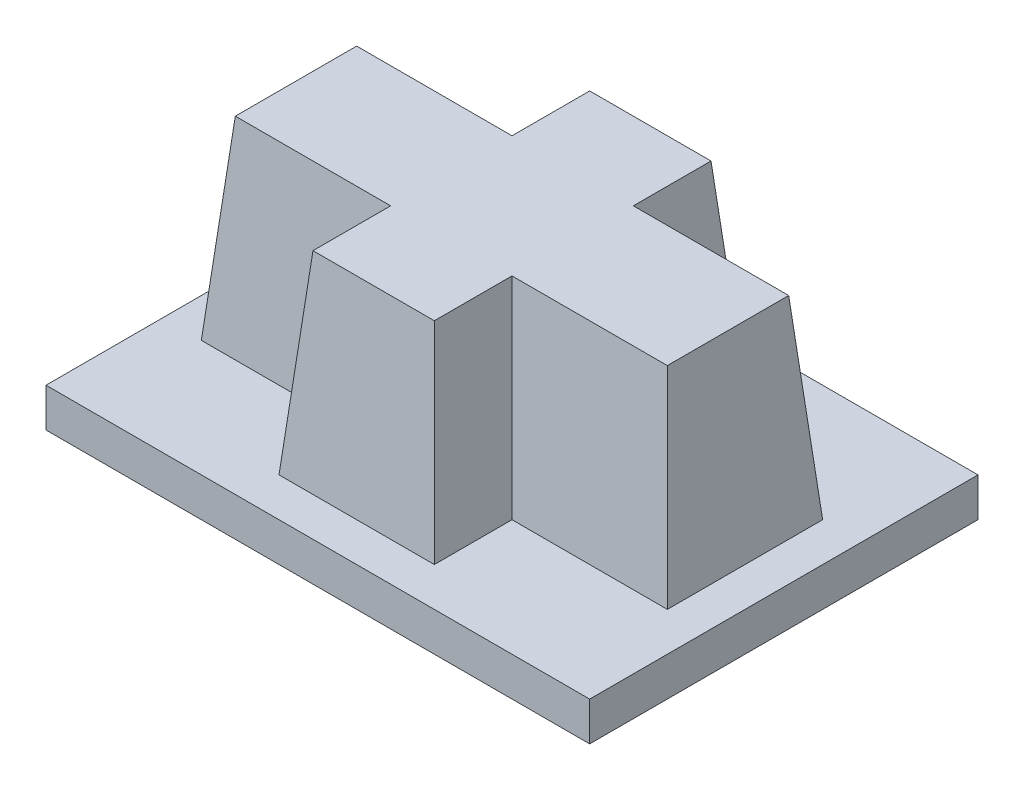
ISO-10303-21;
HEADER;
FILE_DESCRIPTION(('STEP AP214'),'2;1');
FILE_NAME('part.step','',(''),(''),'','','');
FILE_SCHEMA(('AUTOMOTIVE_DESIGN { 1 0 10303 214 1 1 1 1 }'));
ENDSEC;
DATA;
#1=APPLICATION_CONTEXT('core data for automotive mechanical design processes');
#2=APPLICATION_PROTOCOL_DEFINITION('international standard','automotive_design',2000,#1);
#3=PRODUCT_CONTEXT('',#1,'mechanical');
#4=PRODUCT('Part','Part','',(#3));
#5=PRODUCT_RELATED_PRODUCT_CATEGORY('part','',(#4));
#6=PRODUCT_DEFINITION_FORMATION('','',#4);
#7=PRODUCT_DEFINITION_CONTEXT('part definition',#1,'design');
#8=PRODUCT_DEFINITION('design','',#6,#7);
#9=PRODUCT_DEFINITION_SHAPE('','',#8);
#10=(LENGTH_UNIT() NAMED_UNIT(*) SI_UNIT(.MILLI.,.METRE.));
#11=(NAMED_UNIT(*) PLANE_ANGLE_UNIT() SI_UNIT($,.RADIAN.));
#12=(NAMED_UNIT(*) SI_UNIT($,.STERADIAN.) SOLID_ANGLE_UNIT());
#13=UNCERTAINTY_MEASURE_WITH_UNIT(LENGTH_MEASURE(1.E-05),#10,'distance_accuracy_value','');
#14=(GEOMETRIC_REPRESENTATION_CONTEXT(3) GLOBAL_UNCERTAINTY_ASSIGNED_CONTEXT((#13)) GLOBAL_UNIT_ASSIGNED_CONTEXT((#10,
#11,#12)) REPRESENTATION_CONTEXT('',''));
#15=CARTESIAN_POINT('',(0.,0.,0.));
#16=DIRECTION('',(0.,0.,1.));
#17=DIRECTION('',(1.,0.,0.));
#18=AXIS2_PLACEMENT_3D('',#15,#16,#17);
#19=CARTESIAN_POINT('',(70.,10.,-50.));
#20=DIRECTION('',(-1.,0.,0.));
#21=DIRECTION('',(0.,0.,1.));
#22=AXIS2_PLACEMENT_3D('',#19,#20,#21);
#23=PLANE('',#22);
#24=DIRECTION('',(0.,0.,-1.));
#25=VECTOR('',#24,1.);
#26=CARTESIAN_POINT('',(70.,0.,-50.));
#27=LINE('',#26,#25);
#28=CARTESIAN_POINT('',(70.,0.,50.));
#29=VERTEX_POINT('',#28);
#30=CARTESIAN_POINT('',(70.,0.,-50.));
#31=VERTEX_POINT('',#30);
#32=EDGE_CURVE('E178',#29,#31,#27,.T.);
#33=ORIENTED_EDGE('',*,*,#32,.T.);
#34=DIRECTION('',(0.,-1.,0.));
#35=VECTOR('',#34,1.);
#36=CARTESIAN_POINT('',(70.,10.,-50.));
#37=LINE('',#36,#35);
#38=CARTESIAN_POINT('',(70.,10.,-50.));
#39=VERTEX_POINT('',#38);
#40=EDGE_CURVE('E11',#39,#31,#37,.T.);
#41=ORIENTED_EDGE('',*,*,#40,.F.);
#42=DIRECTION('',(0.,0.,-1.));
#43=VECTOR('',#42,1.);
#44=CARTESIAN_POINT('',(70.,10.,-50.));
#45=LINE('',#44,#43);
#46=CARTESIAN_POINT('',(70.,10.,50.));
#47=VERTEX_POINT('',#46);
#48=EDGE_CURVE('E221',#47,#39,#45,.T.);
#49=ORIENTED_EDGE('',*,*,#48,.F.);
#50=DIRECTION('',(0.,-1.,0.));
#51=VECTOR('',#50,1.);
#52=CARTESIAN_POINT('',(70.,10.,50.));
#53=LINE('',#52,#51);
#54=EDGE_CURVE('E235',#47,#29,#53,.T.);
#55=ORIENTED_EDGE('',*,*,#54,.T.);
#56=EDGE_LOOP('',(#33,#41,#49,#55));
#57=FACE_BOUND('',#56,.T.);
#58=ADVANCED_FACE('F39',(#57),#23,.F.);
#59=CARTESIAN_POINT('',(-70.,10.,-50.));
#60=DIRECTION('',(0.,0.,1.));
#61=DIRECTION('',(1.,0.,0.));
#62=AXIS2_PLACEMENT_3D('',#59,#60,#61);
#63=PLANE('',#62);
#64=DIRECTION('',(-1.,0.,0.));
#65=VECTOR('',#64,1.);
#66=CARTESIAN_POINT('',(-70.,0.,-50.));
#67=LINE('',#66,#65);
#68=CARTESIAN_POINT('',(-70.,0.,-50.));
#69=VERTEX_POINT('',#68);
#70=EDGE_CURVE('E239',#31,#69,#67,.T.);
#71=ORIENTED_EDGE('',*,*,#70,.T.);
#72=DIRECTION('',(0.,-1.,0.));
#73=VECTOR('',#72,1.);
#74=CARTESIAN_POINT('',(-70.,10.,-50.));
#75=LINE('',#74,#73);
#76=CARTESIAN_POINT('',(-70.,10.,-50.));
#77=VERTEX_POINT('',#76);
#78=EDGE_CURVE('E47',#77,#69,#75,.T.);
#79=ORIENTED_EDGE('',*,*,#78,.F.);
#80=DIRECTION('',(-1.,0.,0.));
#81=VECTOR('',#80,1.);
#82=CARTESIAN_POINT('',(-70.,10.,-50.));
#83=LINE('',#82,#81);
#84=EDGE_CURVE('E225',#39,#77,#83,.T.);
#85=ORIENTED_EDGE('',*,*,#84,.F.);
#86=ORIENTED_EDGE('',*,*,#40,.T.);
#87=EDGE_LOOP('',(#71,#79,#85,#86));
#88=FACE_BOUND('',#87,.T.);
#89=ADVANCED_FACE('F273',(#88),#63,.F.);
#90=CARTESIAN_POINT('',(-70.,10.,-50.));
#91=DIRECTION('',(1.,0.,0.));
#92=DIRECTION('',(0.,0.,-1.));
#93=AXIS2_PLACEMENT_3D('',#90,#91,#92);
#94=PLANE('',#93);
#95=DIRECTION('',(0.,0.,1.));
#96=VECTOR('',#95,1.);
#97=CARTESIAN_POINT('',(-70.,0.,-50.));
#98=LINE('',#97,#96);
#99=CARTESIAN_POINT('',(-70.,0.,50.));
#100=VERTEX_POINT('',#99);
#101=EDGE_CURVE('E242',#69,#100,#98,.T.);
#102=ORIENTED_EDGE('',*,*,#101,.T.);
#103=DIRECTION('',(0.,-1.,0.));
#104=VECTOR('',#103,1.);
#105=CARTESIAN_POINT('',(-70.,10.,50.));
#106=LINE('',#105,#104);
#107=CARTESIAN_POINT('',(-70.,10.,50.));
#108=VERTEX_POINT('',#107);
#109=EDGE_CURVE('E250',#108,#100,#106,.T.);
#110=ORIENTED_EDGE('',*,*,#109,.F.);
#111=DIRECTION('',(0.,0.,1.));
#112=VECTOR('',#111,1.);
#113=CARTESIAN_POINT('',(-70.,10.,-50.));
#114=LINE('',#113,#112);
#115=EDGE_CURVE('E229',#77,#108,#114,.T.);
#116=ORIENTED_EDGE('',*,*,#115,.F.);
#117=ORIENTED_EDGE('',*,*,#78,.T.);
#118=EDGE_LOOP('',(#102,#110,#116,#117));
#119=FACE_BOUND('',#118,.T.);
#120=ADVANCED_FACE('F259',(#119),#94,.F.);
#121=CARTESIAN_POINT('',(-70.,10.,50.));
#122=DIRECTION('',(0.,0.,-1.));
#123=DIRECTION('',(-1.,0.,0.));
#124=AXIS2_PLACEMENT_3D('',#121,#122,#123);
#125=PLANE('',#124);
#126=DIRECTION('',(1.,0.,0.));
#127=VECTOR('',#126,1.);
#128=CARTESIAN_POINT('',(-70.,0.,50.));
#129=LINE('',#128,#127);
#130=EDGE_CURVE('E226',#100,#29,#129,.T.);
#131=ORIENTED_EDGE('',*,*,#130,.T.);
#132=ORIENTED_EDGE('',*,*,#54,.F.);
#133=DIRECTION('',(1.,0.,0.));
#134=VECTOR('',#133,1.);
#135=CARTESIAN_POINT('',(-70.,10.,50.));
#136=LINE('',#135,#134);
#137=EDGE_CURVE('E232',#108,#47,#136,.T.);
#138=ORIENTED_EDGE('',*,*,#137,.F.);
#139=ORIENTED_EDGE('',*,*,#109,.T.);
#140=EDGE_LOOP('',(#131,#132,#138,#139));
#141=FACE_BOUND('',#140,.T.);
#142=ADVANCED_FACE('F268',(#141),#125,.F.);
#143=CARTESIAN_POINT('',(0.,10.,0.));
#144=DIRECTION('',(0.,1.,0.));
#145=DIRECTION('',(0.,0.,1.));
#146=AXIS2_PLACEMENT_3D('',#143,#144,#145);
#147=PLANE('',#146);
#148=DIRECTION('',(1.,0.,0.));
#149=VECTOR('',#148,1.);
#150=CARTESIAN_POINT('',(20.,10.,20.));
#151=LINE('',#150,#149);
#152=CARTESIAN_POINT('',(20.,10.,20.));
#153=VERTEX_POINT('',#152);
#154=CARTESIAN_POINT('',(60.,10.,20.));
#155=VERTEX_POINT('',#154);
#156=EDGE_CURVE('E54',#153,#155,#151,.T.);
#157=ORIENTED_EDGE('',*,*,#156,.F.);
#158=DIRECTION('',(0.,0.,-1.));
#159=VECTOR('',#158,1.);
#160=CARTESIAN_POINT('',(20.,10.,20.));
#161=LINE('',#160,#159);
#162=CARTESIAN_POINT('',(20.,10.,40.));
#163=VERTEX_POINT('',#162);
#164=EDGE_CURVE('E58',#163,#153,#161,.T.);
#165=ORIENTED_EDGE('',*,*,#164,.F.);
#166=DIRECTION('',(1.,0.,0.));
#167=VECTOR('',#166,1.);
#168=CARTESIAN_POINT('',(-20.,10.,40.));
#169=LINE('',#168,#167);
#170=CARTESIAN_POINT('',(-20.,10.,40.));
#171=VERTEX_POINT('',#170);
#172=EDGE_CURVE('E369',#171,#163,#169,.T.);
#173=ORIENTED_EDGE('',*,*,#172,.F.);
#174=DIRECTION('',(0.,0.,1.));
#175=VECTOR('',#174,1.);
#176=CARTESIAN_POINT('',(-20.,10.,20.));
#177=LINE('',#176,#175);
#178=CARTESIAN_POINT('',(-20.,10.,20.));
#179=VERTEX_POINT('',#178);
#180=EDGE_CURVE('E365',#179,#171,#177,.T.);
#181=ORIENTED_EDGE('',*,*,#180,.F.);
#182=DIRECTION('',(1.,0.,0.));
#183=VECTOR('',#182,1.);
#184=CARTESIAN_POINT('',(-60.,10.,20.));
#185=LINE('',#184,#183);
#186=CARTESIAN_POINT('',(-60.,10.,20.));
#187=VERTEX_POINT('',#186);
#188=EDGE_CURVE('E361',#187,#179,#185,.T.);
#189=ORIENTED_EDGE('',*,*,#188,.F.);
#190=DIRECTION('',(0.,0.,1.));
#191=VECTOR('',#190,1.);
#192=CARTESIAN_POINT('',(-60.,10.,-20.));
#193=LINE('',#192,#191);
#194=CARTESIAN_POINT('',(-60.,10.,-20.));
#195=VERTEX_POINT('',#194);
#196=EDGE_CURVE('E357',#195,#187,#193,.T.);
#197=ORIENTED_EDGE('',*,*,#196,.F.);
#198=DIRECTION('',(-1.,0.,0.));
#199=VECTOR('',#198,1.);
#200=CARTESIAN_POINT('',(-60.,10.,-20.));
#201=LINE('',#200,#199);
#202=CARTESIAN_POINT('',(-20.,10.,-20.));
#203=VERTEX_POINT('',#202);
#204=EDGE_CURVE('E353',#203,#195,#201,.T.);
#205=ORIENTED_EDGE('',*,*,#204,.F.);
#206=DIRECTION('',(0.,0.,1.));
#207=VECTOR('',#206,1.);
#208=CARTESIAN_POINT('',(-20.,10.,-40.));
#209=LINE('',#208,#207);
#210=CARTESIAN_POINT('',(-20.,10.,-40.));
#211=VERTEX_POINT('',#210);
#212=EDGE_CURVE('E349',#211,#203,#209,.T.);
#213=ORIENTED_EDGE('',*,*,#212,.F.);
#214=DIRECTION('',(-1.,0.,0.));
#215=VECTOR('',#214,1.);
#216=CARTESIAN_POINT('',(-20.,10.,-40.));
#217=LINE('',#216,#215);
#218=CARTESIAN_POINT('',(20.,10.,-40.));
#219=VERTEX_POINT('',#218);
#220=EDGE_CURVE('E345',#219,#211,#217,.T.);
#221=ORIENTED_EDGE('',*,*,#220,.F.);
#222=DIRECTION('',(0.,0.,-1.));
#223=VECTOR('',#222,1.);
#224=CARTESIAN_POINT('',(20.,10.,-40.));
#225=LINE('',#224,#223);
#226=CARTESIAN_POINT('',(20.,10.,-20.));
#227=VERTEX_POINT('',#226);
#228=EDGE_CURVE('E155',#227,#219,#225,.T.);
#229=ORIENTED_EDGE('',*,*,#228,.F.);
#230=DIRECTION('',(-1.,0.,0.));
#231=VECTOR('',#230,1.);
#232=CARTESIAN_POINT('',(20.,10.,-20.));
#233=LINE('',#232,#231);
#234=CARTESIAN_POINT('',(60.,10.,-20.));
#235=VERTEX_POINT('',#234);
#236=EDGE_CURVE('E148',#235,#227,#233,.T.);
#237=ORIENTED_EDGE('',*,*,#236,.F.);
#238=DIRECTION('',(0.,0.,-1.));
#239=VECTOR('',#238,1.);
#240=CARTESIAN_POINT('',(60.,10.,-20.));
#241=LINE('',#240,#239);
#242=EDGE_CURVE('E152',#155,#235,#241,.T.);
#243=ORIENTED_EDGE('',*,*,#242,.F.);
#244=EDGE_LOOP('',(#157,#165,#173,#181,#189,#197,#205,#213,#221,#229,#237,#243));
#245=FACE_BOUND('',#244,.T.);
#246=ORIENTED_EDGE('',*,*,#48,.T.);
#247=ORIENTED_EDGE('',*,*,#84,.T.);
#248=ORIENTED_EDGE('',*,*,#115,.T.);
#249=ORIENTED_EDGE('',*,*,#137,.T.);
#250=EDGE_LOOP('',(#246,#247,#248,#249));
#251=FACE_BOUND('',#250,.T.);
#252=ADVANCED_FACE('F150',(#245,#251),#147,.T.);
#253=CARTESIAN_POINT('',(0.,0.,0.));
#254=DIRECTION('',(0.,1.,0.));
#255=DIRECTION('',(0.,0.,1.));
#256=AXIS2_PLACEMENT_3D('',#253,#254,#255);
#257=PLANE('',#256);
#258=ORIENTED_EDGE('',*,*,#32,.F.);
#259=ORIENTED_EDGE('',*,*,#130,.F.);
#260=ORIENTED_EDGE('',*,*,#101,.F.);
#261=ORIENTED_EDGE('',*,*,#70,.F.);
#262=EDGE_LOOP('',(#258,#259,#260,#261));
#263=FACE_BOUND('',#262,.T.);
#264=ADVANCED_FACE('F265',(#263),#257,.F.);
#265=CARTESIAN_POINT('',(20.,10.,20.));
#266=DIRECTION('',(0.,0.0871557427476584,0.996194698091745));
#267=DIRECTION('',(0.,-0.996194698091746,0.0871557427476584));
#268=AXIS2_PLACEMENT_3D('',#265,#266,#267);
#269=PLANE('',#268);
#270=ORIENTED_EDGE('',*,*,#156,.T.);
#271=DIRECTION('',(0.0868265938642478,-0.992432509138967,0.0868265938642478));
#272=VECTOR('',#271,1.);
#273=CARTESIAN_POINT('',(59.6984457039173,13.4467813763474,19.6984457039173));
#274=LINE('',#273,#272);
#275=CARTESIAN_POINT('',(55.6255668237038,60.,15.6255668237038));
#276=VERTEX_POINT('',#275);
#277=EDGE_CURVE('E168',#276,#155,#274,.T.);
#278=ORIENTED_EDGE('',*,*,#277,.F.);
#279=DIRECTION('',(-1.,0.,0.));
#280=VECTOR('',#279,1.);
#281=CARTESIAN_POINT('',(0.,60.,15.6255668237038));
#282=LINE('',#281,#280);
#283=CARTESIAN_POINT('',(15.6255668237038,60.,15.6255668237038));
#284=VERTEX_POINT('',#283);
#285=EDGE_CURVE('E184',#284,#276,#282,.F.);
#286=ORIENTED_EDGE('',*,*,#285,.F.);
#287=DIRECTION('',(0.0868265938642478,-0.992432509138967,0.0868265938642478));
#288=VECTOR('',#287,1.);
#289=CARTESIAN_POINT('',(20.,10.,20.));
#290=LINE('',#289,#288);
#291=EDGE_CURVE('E220',#284,#153,#290,.T.);
#292=ORIENTED_EDGE('',*,*,#291,.T.);
#293=EDGE_LOOP('',(#270,#278,#286,#292));
#294=FACE_BOUND('',#293,.T.);
#295=ADVANCED_FACE('F285',(#294),#269,.T.);
#296=CARTESIAN_POINT('',(60.,10.,-20.));
#297=DIRECTION('',(0.996194698091746,0.0871557427476584,0.));
#298=DIRECTION('',(-0.0871557427476584,0.996194698091746,0.));
#299=AXIS2_PLACEMENT_3D('',#296,#297,#298);
#300=PLANE('',#299);
#301=ORIENTED_EDGE('',*,*,#242,.T.);
#302=DIRECTION('',(0.0868265938642478,-0.992432509138967,-0.0868265938642478));
#303=VECTOR('',#302,1.);
#304=CARTESIAN_POINT('',(59.6984457039173,13.4467813763474,-19.6984457039173));
#305=LINE('',#304,#303);
#306=CARTESIAN_POINT('',(55.6255668237038,60.,-15.6255668237038));
#307=VERTEX_POINT('',#306);
#308=EDGE_CURVE('E165',#307,#235,#305,.T.);
#309=ORIENTED_EDGE('',*,*,#308,.F.);
#310=DIRECTION('',(0.,0.,1.));
#311=VECTOR('',#310,1.);
#312=CARTESIAN_POINT('',(55.6255668237038,60.,0.));
#313=LINE('',#312,#311);
#314=EDGE_CURVE('E188',#276,#307,#313,.F.);
#315=ORIENTED_EDGE('',*,*,#314,.F.);
#316=ORIENTED_EDGE('',*,*,#277,.T.);
#317=EDGE_LOOP('',(#301,#309,#315,#316));
#318=FACE_BOUND('',#317,.T.);
#319=ADVANCED_FACE('F164',(#318),#300,.T.);
#320=CARTESIAN_POINT('',(20.,10.,-20.));
#321=DIRECTION('',(0.,0.0871557427476584,-0.996194698091746));
#322=DIRECTION('',(0.,0.996194698091746,0.0871557427476584));
#323=AXIS2_PLACEMENT_3D('',#320,#321,#322);
#324=PLANE('',#323);
#325=ORIENTED_EDGE('',*,*,#236,.T.);
#326=DIRECTION('',(0.0868265938642478,-0.992432509138967,-0.0868265938642478));
#327=VECTOR('',#326,1.);
#328=CARTESIAN_POINT('',(20.,10.,-20.));
#329=LINE('',#328,#327);
#330=CARTESIAN_POINT('',(15.6255668237038,60.,-15.6255668237038));
#331=VERTEX_POINT('',#330);
#332=EDGE_CURVE('E174',#331,#227,#329,.T.);
#333=ORIENTED_EDGE('',*,*,#332,.F.);
#334=DIRECTION('',(1.,0.,0.));
#335=VECTOR('',#334,1.);
#336=CARTESIAN_POINT('',(0.,60.,-15.6255668237038));
#337=LINE('',#336,#335);
#338=EDGE_CURVE('E172',#307,#331,#337,.F.);
#339=ORIENTED_EDGE('',*,*,#338,.F.);
#340=ORIENTED_EDGE('',*,*,#308,.T.);
#341=EDGE_LOOP('',(#325,#333,#339,#340));
#342=FACE_BOUND('',#341,.T.);
#343=ADVANCED_FACE('F171',(#342),#324,.T.);
#344=CARTESIAN_POINT('',(20.,10.,-40.));
#345=DIRECTION('',(0.996194698091746,0.0871557427476584,0.));
#346=DIRECTION('',(-0.0871557427476584,0.996194698091746,0.));
#347=AXIS2_PLACEMENT_3D('',#344,#345,#346);
#348=PLANE('',#347);
#349=ORIENTED_EDGE('',*,*,#228,.T.);
#350=DIRECTION('',(0.0868265938642478,-0.992432509138967,-0.0868265938642478));
#351=VECTOR('',#350,1.);
#352=CARTESIAN_POINT('',(19.6984457039173,13.4467813763474,-39.6984457039173));
#353=LINE('',#352,#351);
#354=CARTESIAN_POINT('',(15.6255668237038,60.,-35.6255668237038));
#355=VERTEX_POINT('',#354);
#356=EDGE_CURVE('E180',#355,#219,#353,.T.);
#357=ORIENTED_EDGE('',*,*,#356,.F.);
#358=DIRECTION('',(0.,0.,1.));
#359=VECTOR('',#358,1.);
#360=CARTESIAN_POINT('',(15.6255668237038,60.,0.));
#361=LINE('',#360,#359);
#362=EDGE_CURVE('E193',#331,#355,#361,.F.);
#363=ORIENTED_EDGE('',*,*,#362,.F.);
#364=ORIENTED_EDGE('',*,*,#332,.T.);
#365=EDGE_LOOP('',(#349,#357,#363,#364));
#366=FACE_BOUND('',#365,.T.);
#367=ADVANCED_FACE('F292',(#366),#348,.T.);
#368=CARTESIAN_POINT('',(-20.,10.,-40.));
#369=DIRECTION('',(0.,0.0871557427476584,-0.996194698091746));
#370=DIRECTION('',(0.,0.996194698091746,0.0871557427476584));
#371=AXIS2_PLACEMENT_3D('',#368,#369,#370);
#372=PLANE('',#371);
#373=ORIENTED_EDGE('',*,*,#220,.T.);
#374=DIRECTION('',(-0.0868265938642478,-0.992432509138967,-0.0868265938642478));
#375=VECTOR('',#374,1.);
#376=CARTESIAN_POINT('',(-20.,10.,-40.));
#377=LINE('',#376,#375);
#378=CARTESIAN_POINT('',(-15.6255668237038,60.,-35.6255668237038));
#379=VERTEX_POINT('',#378);
#380=EDGE_CURVE('E400',#379,#211,#377,.T.);
#381=ORIENTED_EDGE('',*,*,#380,.F.);
#382=DIRECTION('',(1.,0.,0.));
#383=VECTOR('',#382,1.);
#384=CARTESIAN_POINT('',(0.,60.,-35.6255668237038));
#385=LINE('',#384,#383);
#386=EDGE_CURVE('E196',#355,#379,#385,.F.);
#387=ORIENTED_EDGE('',*,*,#386,.F.);
#388=ORIENTED_EDGE('',*,*,#356,.T.);
#389=EDGE_LOOP('',(#373,#381,#387,#388));
#390=FACE_BOUND('',#389,.T.);
#391=ADVANCED_FACE('F295',(#390),#372,.T.);
#392=CARTESIAN_POINT('',(-20.,10.,-40.));
#393=DIRECTION('',(-0.996194698091746,0.0871557427476584,0.));
#394=DIRECTION('',(-0.0871557427476584,-0.996194698091746,0.));
#395=AXIS2_PLACEMENT_3D('',#392,#393,#394);
#396=PLANE('',#395);
#397=ORIENTED_EDGE('',*,*,#212,.T.);
#398=DIRECTION('',(-0.0868265938642478,-0.992432509138967,-0.0868265938642478));
#399=VECTOR('',#398,1.);
#400=CARTESIAN_POINT('',(-20.1507771480413,8.27660931182629,-20.1507771480413));
#401=LINE('',#400,#399);
#402=CARTESIAN_POINT('',(-15.6255668237038,60.,-15.6255668237038));
#403=VERTEX_POINT('',#402);
#404=EDGE_CURVE('E396',#403,#203,#401,.T.);
#405=ORIENTED_EDGE('',*,*,#404,.F.);
#406=DIRECTION('',(0.,0.,-1.));
#407=VECTOR('',#406,1.);
#408=CARTESIAN_POINT('',(-15.6255668237038,60.,0.));
#409=LINE('',#408,#407);
#410=EDGE_CURVE('E199',#379,#403,#409,.F.);
#411=ORIENTED_EDGE('',*,*,#410,.F.);
#412=ORIENTED_EDGE('',*,*,#380,.T.);
#413=EDGE_LOOP('',(#397,#405,#411,#412));
#414=FACE_BOUND('',#413,.T.);
#415=ADVANCED_FACE('F299',(#414),#396,.T.);
#416=CARTESIAN_POINT('',(-60.,10.,-20.));
#417=DIRECTION('',(0.,0.0871557427476584,-0.996194698091746));
#418=DIRECTION('',(0.,0.996194698091746,0.0871557427476584));
#419=AXIS2_PLACEMENT_3D('',#416,#417,#418);
#420=PLANE('',#419);
#421=ORIENTED_EDGE('',*,*,#204,.T.);
#422=DIRECTION('',(-0.0868265938642478,-0.992432509138967,-0.0868265938642478));
#423=VECTOR('',#422,1.);
#424=CARTESIAN_POINT('',(-60.,10.,-20.));
#425=LINE('',#424,#423);
#426=CARTESIAN_POINT('',(-55.6255668237038,60.,-15.6255668237038));
#427=VERTEX_POINT('',#426);
#428=EDGE_CURVE('E392',#427,#195,#425,.T.);
#429=ORIENTED_EDGE('',*,*,#428,.F.);
#430=DIRECTION('',(1.,0.,0.));
#431=VECTOR('',#430,1.);
#432=CARTESIAN_POINT('',(0.,60.,-15.6255668237038));
#433=LINE('',#432,#431);
#434=EDGE_CURVE('E202',#403,#427,#433,.F.);
#435=ORIENTED_EDGE('',*,*,#434,.F.);
#436=ORIENTED_EDGE('',*,*,#404,.T.);
#437=EDGE_LOOP('',(#421,#429,#435,#436));
#438=FACE_BOUND('',#437,.T.);
#439=ADVANCED_FACE('F303',(#438),#420,.T.);
#440=CARTESIAN_POINT('',(-60.,10.,-20.));
#441=DIRECTION('',(-0.996194698091746,0.0871557427476584,0.));
#442=DIRECTION('',(-0.0871557427476584,-0.996194698091746,0.));
#443=AXIS2_PLACEMENT_3D('',#440,#441,#442);
#444=PLANE('',#443);
#445=ORIENTED_EDGE('',*,*,#196,.T.);
#446=DIRECTION('',(-0.0868265938642478,-0.992432509138967,0.0868265938642478));
#447=VECTOR('',#446,1.);
#448=CARTESIAN_POINT('',(-60.,10.,20.));
#449=LINE('',#448,#447);
#450=CARTESIAN_POINT('',(-55.6255668237038,60.,15.6255668237038));
#451=VERTEX_POINT('',#450);
#452=EDGE_CURVE('E388',#451,#187,#449,.T.);
#453=ORIENTED_EDGE('',*,*,#452,.F.);
#454=DIRECTION('',(0.,0.,-1.));
#455=VECTOR('',#454,1.);
#456=CARTESIAN_POINT('',(-55.6255668237038,60.,0.));
#457=LINE('',#456,#455);
#458=EDGE_CURVE('E205',#427,#451,#457,.F.);
#459=ORIENTED_EDGE('',*,*,#458,.F.);
#460=ORIENTED_EDGE('',*,*,#428,.T.);
#461=EDGE_LOOP('',(#445,#453,#459,#460));
#462=FACE_BOUND('',#461,.T.);
#463=ADVANCED_FACE('F307',(#462),#444,.T.);
#464=CARTESIAN_POINT('',(-60.,10.,20.));
#465=DIRECTION('',(0.,0.0871557427476584,0.996194698091746));
#466=DIRECTION('',(0.,-0.996194698091746,0.0871557427476584));
#467=AXIS2_PLACEMENT_3D('',#464,#465,#466);
#468=PLANE('',#467);
#469=ORIENTED_EDGE('',*,*,#188,.T.);
#470=DIRECTION('',(-0.0868265938642478,-0.992432509138967,0.0868265938642478));
#471=VECTOR('',#470,1.);
#472=CARTESIAN_POINT('',(-20.3015542960827,6.55321862365258,20.3015542960827));
#473=LINE('',#472,#471);
#474=CARTESIAN_POINT('',(-15.6255668237038,60.,15.6255668237038));
#475=VERTEX_POINT('',#474);
#476=EDGE_CURVE('E384',#475,#179,#473,.T.);
#477=ORIENTED_EDGE('',*,*,#476,.F.);
#478=DIRECTION('',(-1.,0.,0.));
#479=VECTOR('',#478,1.);
#480=CARTESIAN_POINT('',(0.,60.,15.6255668237038));
#481=LINE('',#480,#479);
#482=EDGE_CURVE('E208',#451,#475,#481,.F.);
#483=ORIENTED_EDGE('',*,*,#482,.F.);
#484=ORIENTED_EDGE('',*,*,#452,.T.);
#485=EDGE_LOOP('',(#469,#477,#483,#484));
#486=FACE_BOUND('',#485,.T.);
#487=ADVANCED_FACE('F311',(#486),#468,.T.);
#488=CARTESIAN_POINT('',(-20.,10.,20.));
#489=DIRECTION('',(-0.996194698091746,0.0871557427476584,0.));
#490=DIRECTION('',(-0.0871557427476584,-0.996194698091746,0.));
#491=AXIS2_PLACEMENT_3D('',#488,#489,#490);
#492=PLANE('',#491);
#493=ORIENTED_EDGE('',*,*,#180,.T.);
#494=DIRECTION('',(-0.0868265938642478,-0.992432509138967,0.0868265938642478));
#495=VECTOR('',#494,1.);
#496=CARTESIAN_POINT('',(-20.,10.,40.));
#497=LINE('',#496,#495);
#498=CARTESIAN_POINT('',(-15.6255668237038,60.,35.6255668237038));
#499=VERTEX_POINT('',#498);
#500=EDGE_CURVE('E380',#499,#171,#497,.T.);
#501=ORIENTED_EDGE('',*,*,#500,.F.);
#502=DIRECTION('',(0.,0.,-1.));
#503=VECTOR('',#502,1.);
#504=CARTESIAN_POINT('',(-15.6255668237038,60.,0.));
#505=LINE('',#504,#503);
#506=EDGE_CURVE('E211',#475,#499,#505,.F.);
#507=ORIENTED_EDGE('',*,*,#506,.F.);
#508=ORIENTED_EDGE('',*,*,#476,.T.);
#509=EDGE_LOOP('',(#493,#501,#507,#508));
#510=FACE_BOUND('',#509,.T.);
#511=ADVANCED_FACE('F315',(#510),#492,.T.);
#512=CARTESIAN_POINT('',(-20.,10.,40.));
#513=DIRECTION('',(0.,0.0871557427476584,0.996194698091746));
#514=DIRECTION('',(0.,-0.996194698091746,0.0871557427476584));
#515=AXIS2_PLACEMENT_3D('',#512,#513,#514);
#516=PLANE('',#515);
#517=ORIENTED_EDGE('',*,*,#172,.T.);
#518=DIRECTION('',(0.0868265938642478,-0.992432509138967,0.0868265938642478));
#519=VECTOR('',#518,1.);
#520=CARTESIAN_POINT('',(19.8492228519587,11.7233906881737,39.8492228519587));
#521=LINE('',#520,#519);
#522=CARTESIAN_POINT('',(15.6255668237038,60.,35.6255668237038));
#523=VERTEX_POINT('',#522);
#524=EDGE_CURVE('E376',#523,#163,#521,.T.);
#525=ORIENTED_EDGE('',*,*,#524,.F.);
#526=DIRECTION('',(-1.,0.,0.));
#527=VECTOR('',#526,1.);
#528=CARTESIAN_POINT('',(0.,60.,35.6255668237038));
#529=LINE('',#528,#527);
#530=EDGE_CURVE('E214',#499,#523,#529,.F.);
#531=ORIENTED_EDGE('',*,*,#530,.F.);
#532=ORIENTED_EDGE('',*,*,#500,.T.);
#533=EDGE_LOOP('',(#517,#525,#531,#532));
#534=FACE_BOUND('',#533,.T.);
#535=ADVANCED_FACE('F319',(#534),#516,.T.);
#536=CARTESIAN_POINT('',(20.,10.,20.));
#537=DIRECTION('',(0.996194698091746,0.0871557427476584,0.));
#538=DIRECTION('',(-0.0871557427476584,0.996194698091746,0.));
#539=AXIS2_PLACEMENT_3D('',#536,#537,#538);
#540=PLANE('',#539);
#541=ORIENTED_EDGE('',*,*,#164,.T.);
#542=ORIENTED_EDGE('',*,*,#291,.F.);
#543=DIRECTION('',(0.,0.,1.));
#544=VECTOR('',#543,1.);
#545=CARTESIAN_POINT('',(15.6255668237038,60.,0.));
#546=LINE('',#545,#544);
#547=EDGE_CURVE('E217',#523,#284,#546,.F.);
#548=ORIENTED_EDGE('',*,*,#547,.F.);
#549=ORIENTED_EDGE('',*,*,#524,.T.);
#550=EDGE_LOOP('',(#541,#542,#548,#549));
#551=FACE_BOUND('',#550,.T.);
#552=ADVANCED_FACE('F323',(#551),#540,.T.);
#553=CARTESIAN_POINT('',(0.,60.,0.));
#554=DIRECTION('',(0.,-1.,0.));
#555=DIRECTION('',(0.,0.,-1.));
#556=AXIS2_PLACEMENT_3D('',#553,#554,#555);
#557=PLANE('',#556);
#558=ORIENTED_EDGE('',*,*,#285,.T.);
#559=ORIENTED_EDGE('',*,*,#314,.T.);
#560=ORIENTED_EDGE('',*,*,#338,.T.);
#561=ORIENTED_EDGE('',*,*,#362,.T.);
#562=ORIENTED_EDGE('',*,*,#386,.T.);
#563=ORIENTED_EDGE('',*,*,#410,.T.);
#564=ORIENTED_EDGE('',*,*,#434,.T.);
#565=ORIENTED_EDGE('',*,*,#458,.T.);
#566=ORIENTED_EDGE('',*,*,#482,.T.);
#567=ORIENTED_EDGE('',*,*,#506,.T.);
#568=ORIENTED_EDGE('',*,*,#530,.T.);
#569=ORIENTED_EDGE('',*,*,#547,.T.);
#570=EDGE_LOOP('',(#558,#559,#560,#561,#562,#563,#564,#565,#566,#567,#568,#569));
#571=FACE_BOUND('',#570,.T.);
#572=ADVANCED_FACE('F327',(#571),#557,.F.);
#573=CLOSED_SHELL('',(#58,#89,#120,#142,#252,#264,#295,#319,#343,#367,#391,#415,#439,#463,#487,
#511,#535,#552,#572));
#574=MANIFOLD_SOLID_BREP('B2',#573);
#575=ADVANCED_BREP_SHAPE_REPRESENTATION('',(#18,#574),#14);
#576=SHAPE_DEFINITION_REPRESENTATION(#9,#575);
ENDSEC;
END-ISO-10303-21;
